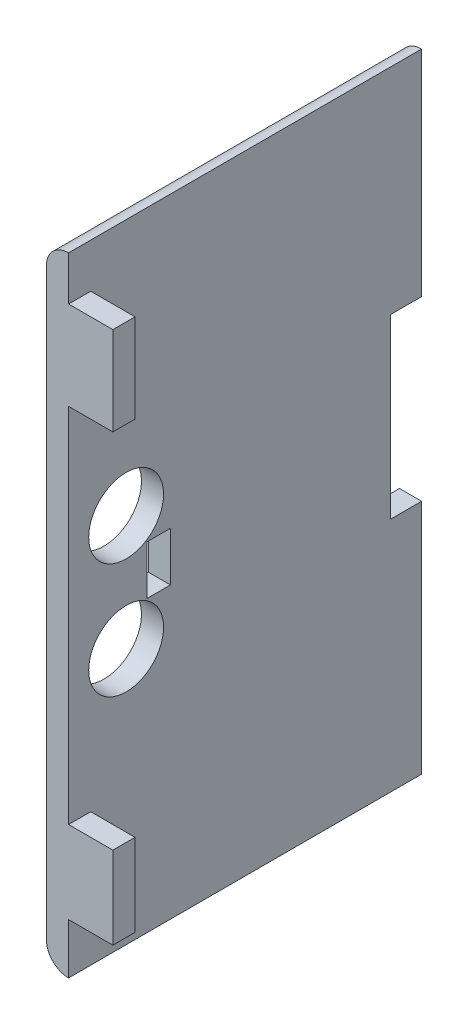
ISO-10303-21;
HEADER;
FILE_DESCRIPTION(('STEP AP214'),'2;1');
FILE_NAME('part.step','',(''),(''),'','','');
FILE_SCHEMA(('AUTOMOTIVE_DESIGN { 1 0 10303 214 1 1 1 1 }'));
ENDSEC;
DATA;
#1=APPLICATION_CONTEXT('core data for automotive mechanical design processes');
#2=APPLICATION_PROTOCOL_DEFINITION('international standard','automotive_design',2000,#1);
#3=PRODUCT_CONTEXT('',#1,'mechanical');
#4=PRODUCT('Part','Part','',(#3));
#5=PRODUCT_RELATED_PRODUCT_CATEGORY('part','',(#4));
#6=PRODUCT_DEFINITION_FORMATION('','',#4);
#7=PRODUCT_DEFINITION_CONTEXT('part definition',#1,'design');
#8=PRODUCT_DEFINITION('design','',#6,#7);
#9=PRODUCT_DEFINITION_SHAPE('','',#8);
#10=(LENGTH_UNIT() NAMED_UNIT(*) SI_UNIT(.MILLI.,.METRE.));
#11=(NAMED_UNIT(*) PLANE_ANGLE_UNIT() SI_UNIT($,.RADIAN.));
#12=(NAMED_UNIT(*) SI_UNIT($,.STERADIAN.) SOLID_ANGLE_UNIT());
#13=UNCERTAINTY_MEASURE_WITH_UNIT(LENGTH_MEASURE(1.E-05),#10,'distance_accuracy_value','');
#14=(GEOMETRIC_REPRESENTATION_CONTEXT(3) GLOBAL_UNCERTAINTY_ASSIGNED_CONTEXT((#13)) GLOBAL_UNIT_ASSIGNED_CONTEXT((#10,
#11,#12)) REPRESENTATION_CONTEXT('',''));
#15=CARTESIAN_POINT('',(0.,0.,0.));
#16=DIRECTION('',(0.,0.,1.));
#17=DIRECTION('',(1.,0.,0.));
#18=AXIS2_PLACEMENT_3D('',#15,#16,#17);
#19=CARTESIAN_POINT('',(-104.891736532619,68.3974089750559,-79.6889603598296));
#20=DIRECTION('',(0.,0.,1.));
#21=DIRECTION('',(1.,0.,0.));
#22=AXIS2_PLACEMENT_3D('',#19,#20,#21);
#23=PLANE('',#22);
#24=DIRECTION('',(0.,-1.,0.));
#25=VECTOR('',#24,1.);
#26=CARTESIAN_POINT('',(-104.891736532619,68.3974089750559,-79.6889603598296));
#27=LINE('',#26,#25);
#28=CARTESIAN_POINT('',(-104.891736532619,-20.,-79.6889603598296));
#29=VERTEX_POINT('',#28);
#30=CARTESIAN_POINT('',(-104.891736532619,-68.3438293693288,-79.6889603598296));
#31=VERTEX_POINT('',#30);
#32=EDGE_CURVE('E321',#29,#31,#27,.T.);
#33=ORIENTED_EDGE('',*,*,#32,.F.);
#34=DIRECTION('',(1.,0.,0.));
#35=VECTOR('',#34,1.);
#36=CARTESIAN_POINT('',(-109.891736532619,-20.,-79.6889603598296));
#37=LINE('',#36,#35);
#38=CARTESIAN_POINT('',(-99.8917365326188,-20.,-79.6889603598296));
#39=VERTEX_POINT('',#38);
#40=EDGE_CURVE('E254',#29,#39,#37,.T.);
#41=ORIENTED_EDGE('',*,*,#40,.T.);
#42=DIRECTION('',(0.,-1.,0.));
#43=VECTOR('',#42,1.);
#44=CARTESIAN_POINT('',(-99.8917365326188,68.3974089750559,-79.6889603598296));
#45=LINE('',#44,#43);
#46=CARTESIAN_POINT('',(-99.8917365326188,-73.3438293693289,-79.6889603598296));
#47=VERTEX_POINT('',#46);
#48=EDGE_CURVE('E333',#39,#47,#45,.T.);
#49=ORIENTED_EDGE('',*,*,#48,.T.);
#50=CARTESIAN_POINT('',(-99.8917365326188,-68.3438293693289,-79.6889603598296));
#51=DIRECTION('',(0.,0.,1.));
#52=DIRECTION('',(1.,0.,0.));
#53=AXIS2_PLACEMENT_3D('',#50,#51,#52);
#54=CIRCLE('',#53,5.);
#55=EDGE_CURVE('E358',#47,#31,#54,.F.);
#56=ORIENTED_EDGE('',*,*,#55,.T.);
#57=EDGE_LOOP('',(#33,#41,#49,#56));
#58=FACE_BOUND('',#57,.T.);
#59=ADVANCED_FACE('F73',(#58),#23,.F.);
#60=CARTESIAN_POINT('',(-104.891736532619,68.3974089750559,0.));
#61=DIRECTION('',(0.,0.,-1.));
#62=DIRECTION('',(-1.,0.,0.));
#63=AXIS2_PLACEMENT_3D('',#60,#61,#62);
#64=PLANE('',#63);
#65=DIRECTION('',(0.,1.,0.));
#66=VECTOR('',#65,1.);
#67=CARTESIAN_POINT('',(-99.8917365326188,68.3974089750559,0.));
#68=LINE('',#67,#66);
#69=CARTESIAN_POINT('',(-99.8917365326188,-73.3438293693288,0.));
#70=VERTEX_POINT('',#69);
#71=CARTESIAN_POINT('',(-99.8917365326188,-61.922986139183,0.));
#72=VERTEX_POINT('',#71);
#73=EDGE_CURVE('E327',#70,#72,#68,.T.);
#74=ORIENTED_EDGE('',*,*,#73,.T.);
#75=DIRECTION('',(1.,0.,0.));
#76=VECTOR('',#75,1.);
#77=CARTESIAN_POINT('',(-104.891736532619,-61.922986139183,0.));
#78=LINE('',#77,#76);
#79=CARTESIAN_POINT('',(-89.8917365326188,-61.922986139183,0.));
#80=VERTEX_POINT('',#79);
#81=EDGE_CURVE('E276',#72,#80,#78,.T.);
#82=ORIENTED_EDGE('',*,*,#81,.T.);
#83=DIRECTION('',(0.,1.,0.));
#84=VECTOR('',#83,1.);
#85=CARTESIAN_POINT('',(-89.8917365326188,-63.3438293693289,0.));
#86=LINE('',#85,#84);
#87=CARTESIAN_POINT('',(-89.8917365326188,-43.3438293693289,0.));
#88=VERTEX_POINT('',#87);
#89=EDGE_CURVE('E303',#80,#88,#86,.T.);
#90=ORIENTED_EDGE('',*,*,#89,.T.);
#91=DIRECTION('',(-1.,0.,0.));
#92=VECTOR('',#91,1.);
#93=CARTESIAN_POINT('',(-89.8917365326188,-43.3438293693289,0.));
#94=LINE('',#93,#92);
#95=CARTESIAN_POINT('',(-99.8917365326188,-43.3438293693289,0.));
#96=VERTEX_POINT('',#95);
#97=EDGE_CURVE('E311',#88,#96,#94,.T.);
#98=ORIENTED_EDGE('',*,*,#97,.T.);
#99=CARTESIAN_POINT('',(-99.8917365326188,38.397408975056,0.));
#100=VERTEX_POINT('',#99);
#101=EDGE_CURVE('E330',#96,#100,#68,.T.);
#102=ORIENTED_EDGE('',*,*,#101,.T.);
#103=DIRECTION('',(-1.,0.,0.));
#104=VECTOR('',#103,1.);
#105=CARTESIAN_POINT('',(-89.8917365326188,38.3974089750559,0.));
#106=LINE('',#105,#104);
#107=CARTESIAN_POINT('',(-89.8917365326188,38.3974089750559,0.));
#108=VERTEX_POINT('',#107);
#109=EDGE_CURVE('E279',#108,#100,#106,.T.);
#110=ORIENTED_EDGE('',*,*,#109,.F.);
#111=DIRECTION('',(0.,1.,0.));
#112=VECTOR('',#111,1.);
#113=CARTESIAN_POINT('',(-89.8917365326188,58.397408975056,0.));
#114=LINE('',#113,#112);
#115=CARTESIAN_POINT('',(-89.8917365326188,58.397408975056,0.));
#116=VERTEX_POINT('',#115);
#117=EDGE_CURVE('E300',#108,#116,#114,.T.);
#118=ORIENTED_EDGE('',*,*,#117,.T.);
#119=DIRECTION('',(-1.,0.,0.));
#120=VECTOR('',#119,1.);
#121=CARTESIAN_POINT('',(-89.8917365326188,58.397408975056,0.));
#122=LINE('',#121,#120);
#123=CARTESIAN_POINT('',(-99.8917365326188,58.397408975056,0.));
#124=VERTEX_POINT('',#123);
#125=EDGE_CURVE('E280',#116,#124,#122,.T.);
#126=ORIENTED_EDGE('',*,*,#125,.T.);
#127=CARTESIAN_POINT('',(-99.8917365326188,68.3974089750559,0.));
#128=VERTEX_POINT('',#127);
#129=EDGE_CURVE('E315',#124,#128,#68,.T.);
#130=ORIENTED_EDGE('',*,*,#129,.T.);
#131=CARTESIAN_POINT('',(-99.8917365326188,63.3974089750559,0.));
#132=DIRECTION('',(0.,0.,-1.));
#133=DIRECTION('',(-1.,0.,0.));
#134=AXIS2_PLACEMENT_3D('',#131,#132,#133);
#135=CIRCLE('',#134,5.);
#136=CARTESIAN_POINT('',(-104.891736532619,63.3974089750559,0.));
#137=VERTEX_POINT('',#136);
#138=EDGE_CURVE('E365',#128,#137,#135,.F.);
#139=ORIENTED_EDGE('',*,*,#138,.T.);
#140=DIRECTION('',(0.,1.,0.));
#141=VECTOR('',#140,1.);
#142=CARTESIAN_POINT('',(-104.891736532619,68.3974089750559,0.));
#143=LINE('',#142,#141);
#144=CARTESIAN_POINT('',(-104.891736532619,-68.3438293693288,0.));
#145=VERTEX_POINT('',#144);
#146=EDGE_CURVE('E318',#145,#137,#143,.T.);
#147=ORIENTED_EDGE('',*,*,#146,.F.);
#148=CARTESIAN_POINT('',(-99.8917365326188,-68.3438293693288,0.));
#149=DIRECTION('',(0.,0.,-1.));
#150=DIRECTION('',(-1.,0.,0.));
#151=AXIS2_PLACEMENT_3D('',#148,#149,#150);
#152=CIRCLE('',#151,5.);
#153=EDGE_CURVE('E363',#145,#70,#152,.F.);
#154=ORIENTED_EDGE('',*,*,#153,.T.);
#155=EDGE_LOOP('',(#74,#82,#90,#98,#102,#110,#118,#126,#130,#139,#147,#154));
#156=FACE_BOUND('',#155,.T.);
#157=ADVANCED_FACE('F398',(#156),#64,.F.);
#158=CARTESIAN_POINT('',(-99.8917365326188,68.3974089750559,-79.6889603598296));
#159=VERTEX_POINT('',#158);
#160=CARTESIAN_POINT('',(-99.8917365326188,20.,-79.6889603598296));
#161=VERTEX_POINT('',#160);
#162=EDGE_CURVE('E334',#159,#161,#45,.T.);
#163=ORIENTED_EDGE('',*,*,#162,.T.);
#164=DIRECTION('',(1.,0.,0.));
#165=VECTOR('',#164,1.);
#166=CARTESIAN_POINT('',(-109.891736532619,20.,-79.6889603598296));
#167=LINE('',#166,#165);
#168=CARTESIAN_POINT('',(-104.891736532619,20.,-79.6889603598296));
#169=VERTEX_POINT('',#168);
#170=EDGE_CURVE('E253',#169,#161,#167,.T.);
#171=ORIENTED_EDGE('',*,*,#170,.F.);
#172=CARTESIAN_POINT('',(-104.891736532619,63.3974089750559,-79.6889603598296));
#173=VERTEX_POINT('',#172);
#174=EDGE_CURVE('E323',#173,#169,#27,.T.);
#175=ORIENTED_EDGE('',*,*,#174,.F.);
#176=CARTESIAN_POINT('',(-99.8917365326188,63.3974089750559,-79.6889603598296));
#177=DIRECTION('',(0.,0.,1.));
#178=DIRECTION('',(1.,0.,0.));
#179=AXIS2_PLACEMENT_3D('',#176,#177,#178);
#180=CIRCLE('',#179,5.);
#181=EDGE_CURVE('E361',#173,#159,#180,.F.);
#182=ORIENTED_EDGE('',*,*,#181,.T.);
#183=EDGE_LOOP('',(#163,#171,#175,#182));
#184=FACE_BOUND('',#183,.T.);
#185=ADVANCED_FACE('F401',(#184),#23,.F.);
#186=CARTESIAN_POINT('',(-104.891736532619,0.,0.));
#187=DIRECTION('',(1.,0.,0.));
#188=DIRECTION('',(0.,0.,-1.));
#189=AXIS2_PLACEMENT_3D('',#186,#187,#188);
#190=PLANE('',#189);
#191=CARTESIAN_POINT('',(-104.891736532619,-15.4732101971364,-13.));
#192=DIRECTION('',(-1.,0.,0.));
#193=DIRECTION('',(0.,0.,1.));
#194=AXIS2_PLACEMENT_3D('',#191,#192,#193);
#195=CIRCLE('',#194,8.45);
#196=CARTESIAN_POINT('',(-104.891736532619,-15.4732101971364,-4.55));
#197=VERTEX_POINT('',#196);
#198=EDGE_CURVE('E236',#197,#197,#195,.T.);
#199=ORIENTED_EDGE('',*,*,#198,.F.);
#200=EDGE_LOOP('',(#199));
#201=FACE_BOUND('',#200,.T.);
#202=DIRECTION('',(0.,0.,-1.));
#203=VECTOR('',#202,1.);
#204=CARTESIAN_POINT('',(-104.891736532619,3.06678980286357,0.));
#205=LINE('',#204,#203);
#206=CARTESIAN_POINT('',(-104.891736532619,3.06678980286356,-17.68));
#207=VERTEX_POINT('',#206);
#208=CARTESIAN_POINT('',(-104.891736532619,3.06678980286356,-23.));
#209=VERTEX_POINT('',#208);
#210=EDGE_CURVE('E222',#207,#209,#205,.T.);
#211=ORIENTED_EDGE('',*,*,#210,.F.);
#212=DIRECTION('',(0.,1.,0.));
#213=VECTOR('',#212,1.);
#214=CARTESIAN_POINT('',(-104.891736532619,0.,-17.68));
#215=LINE('',#214,#213);
#216=CARTESIAN_POINT('',(-104.891736532619,-8.01321019713644,-17.68));
#217=VERTEX_POINT('',#216);
#218=EDGE_CURVE('E89',#217,#207,#215,.T.);
#219=ORIENTED_EDGE('',*,*,#218,.F.);
#220=DIRECTION('',(0.,0.,1.));
#221=VECTOR('',#220,1.);
#222=CARTESIAN_POINT('',(-104.891736532619,-8.01321019713643,0.));
#223=LINE('',#222,#221);
#224=CARTESIAN_POINT('',(-104.891736532619,-8.01321019713644,-23.));
#225=VERTEX_POINT('',#224);
#226=EDGE_CURVE('E229',#225,#217,#223,.T.);
#227=ORIENTED_EDGE('',*,*,#226,.F.);
#228=DIRECTION('',(0.,1.,0.));
#229=VECTOR('',#228,1.);
#230=CARTESIAN_POINT('',(-104.891736532619,0.,-23.));
#231=LINE('',#230,#229);
#232=EDGE_CURVE('E213',#225,#209,#231,.T.);
#233=ORIENTED_EDGE('',*,*,#232,.T.);
#234=EDGE_LOOP('',(#211,#219,#227,#233));
#235=FACE_BOUND('',#234,.T.);
#236=CARTESIAN_POINT('',(-104.891736532619,10.5267898028636,-13.));
#237=DIRECTION('',(-1.,0.,0.));
#238=DIRECTION('',(0.,0.,1.));
#239=AXIS2_PLACEMENT_3D('',#236,#237,#238);
#240=CIRCLE('',#239,8.45);
#241=CARTESIAN_POINT('',(-104.891736532619,10.5267898028636,-4.55));
#242=VERTEX_POINT('',#241);
#243=EDGE_CURVE('E241',#242,#242,#240,.T.);
#244=ORIENTED_EDGE('',*,*,#243,.F.);
#245=EDGE_LOOP('',(#244));
#246=FACE_BOUND('',#245,.T.);
#247=DIRECTION('',(0.,-1.,0.));
#248=VECTOR('',#247,1.);
#249=CARTESIAN_POINT('',(-104.891736532619,0.,-72.6889603598296));
#250=LINE('',#249,#248);
#251=CARTESIAN_POINT('',(-104.891736532619,20.,-72.6889603598296));
#252=VERTEX_POINT('',#251);
#253=CARTESIAN_POINT('',(-104.891736532619,-20.,-72.6889603598296));
#254=VERTEX_POINT('',#253);
#255=EDGE_CURVE('E265',#252,#254,#250,.T.);
#256=ORIENTED_EDGE('',*,*,#255,.T.);
#257=DIRECTION('',(0.,0.,-1.));
#258=VECTOR('',#257,1.);
#259=CARTESIAN_POINT('',(-104.891736532619,-19.9999999999999,0.));
#260=LINE('',#259,#258);
#261=EDGE_CURVE('E268',#254,#29,#260,.T.);
#262=ORIENTED_EDGE('',*,*,#261,.T.);
#263=ORIENTED_EDGE('',*,*,#32,.T.);
#264=DIRECTION('',(0.,0.,1.));
#265=VECTOR('',#264,1.);
#266=CARTESIAN_POINT('',(-104.891736532619,-68.3438293693288,0.));
#267=LINE('',#266,#265);
#268=EDGE_CURVE('E352',#31,#145,#267,.T.);
#269=ORIENTED_EDGE('',*,*,#268,.T.);
#270=ORIENTED_EDGE('',*,*,#146,.T.);
#271=DIRECTION('',(0.,0.,-1.));
#272=VECTOR('',#271,1.);
#273=CARTESIAN_POINT('',(-104.891736532619,63.3974089750559,0.));
#274=LINE('',#273,#272);
#275=EDGE_CURVE('E355',#137,#173,#274,.T.);
#276=ORIENTED_EDGE('',*,*,#275,.T.);
#277=ORIENTED_EDGE('',*,*,#174,.T.);
#278=DIRECTION('',(0.,0.,1.));
#279=VECTOR('',#278,1.);
#280=CARTESIAN_POINT('',(-104.891736532619,20.,0.));
#281=LINE('',#280,#279);
#282=EDGE_CURVE('E257',#169,#252,#281,.T.);
#283=ORIENTED_EDGE('',*,*,#282,.T.);
#284=EDGE_LOOP('',(#256,#262,#263,#269,#270,#276,#277,#283));
#285=FACE_BOUND('',#284,.T.);
#286=ADVANCED_FACE('F226',(#201,#235,#246,#285),#190,.F.);
#287=CARTESIAN_POINT('',(-99.8917365326188,0.,0.));
#288=DIRECTION('',(1.,0.,0.));
#289=DIRECTION('',(0.,0.,-1.));
#290=AXIS2_PLACEMENT_3D('',#287,#288,#289);
#291=PLANE('',#290);
#292=CARTESIAN_POINT('',(-99.8917365326188,-15.4732101971364,-13.));
#293=DIRECTION('',(1.,0.,0.));
#294=DIRECTION('',(0.,0.,-1.));
#295=AXIS2_PLACEMENT_3D('',#292,#293,#294);
#296=CIRCLE('',#295,8.45);
#297=CARTESIAN_POINT('',(-99.8917365326188,-15.4732101971364,-21.45));
#298=VERTEX_POINT('',#297);
#299=EDGE_CURVE('E77',#298,#298,#296,.T.);
#300=ORIENTED_EDGE('',*,*,#299,.F.);
#301=EDGE_LOOP('',(#300));
#302=FACE_BOUND('',#301,.T.);
#303=DIRECTION('',(0.,-1.,0.));
#304=VECTOR('',#303,1.);
#305=CARTESIAN_POINT('',(-99.8917365326188,0.,-17.68));
#306=LINE('',#305,#304);
#307=CARTESIAN_POINT('',(-99.8917365326188,3.06678980286356,-17.68));
#308=VERTEX_POINT('',#307);
#309=CARTESIAN_POINT('',(-99.8917365326188,-8.01321019713644,-17.68));
#310=VERTEX_POINT('',#309);
#311=EDGE_CURVE('E12',#308,#310,#306,.T.);
#312=ORIENTED_EDGE('',*,*,#311,.F.);
#313=DIRECTION('',(0.,0.,1.));
#314=VECTOR('',#313,1.);
#315=CARTESIAN_POINT('',(-99.8917365326188,3.06678980286357,0.));
#316=LINE('',#315,#314);
#317=CARTESIAN_POINT('',(-99.8917365326188,3.06678980286355,-23.));
#318=VERTEX_POINT('',#317);
#319=EDGE_CURVE('E370',#318,#308,#316,.T.);
#320=ORIENTED_EDGE('',*,*,#319,.F.);
#321=DIRECTION('',(0.,-1.,0.));
#322=VECTOR('',#321,1.);
#323=CARTESIAN_POINT('',(-99.8917365326188,0.,-23.));
#324=LINE('',#323,#322);
#325=CARTESIAN_POINT('',(-99.8917365326188,-8.01321019713644,-23.));
#326=VERTEX_POINT('',#325);
#327=EDGE_CURVE('E216',#318,#326,#324,.T.);
#328=ORIENTED_EDGE('',*,*,#327,.T.);
#329=DIRECTION('',(0.,0.,-1.));
#330=VECTOR('',#329,1.);
#331=CARTESIAN_POINT('',(-99.8917365326188,-8.01321019713643,0.));
#332=LINE('',#331,#330);
#333=EDGE_CURVE('E82',#310,#326,#332,.T.);
#334=ORIENTED_EDGE('',*,*,#333,.F.);
#335=EDGE_LOOP('',(#312,#320,#328,#334));
#336=FACE_BOUND('',#335,.T.);
#337=CARTESIAN_POINT('',(-99.8917365326188,10.5267898028636,-13.));
#338=DIRECTION('',(1.,0.,0.));
#339=DIRECTION('',(0.,0.,-1.));
#340=AXIS2_PLACEMENT_3D('',#337,#338,#339);
#341=CIRCLE('',#340,8.45);
#342=CARTESIAN_POINT('',(-99.8917365326188,10.5267898028636,-21.45));
#343=VERTEX_POINT('',#342);
#344=EDGE_CURVE('E244',#343,#343,#341,.T.);
#345=ORIENTED_EDGE('',*,*,#344,.F.);
#346=EDGE_LOOP('',(#345));
#347=FACE_BOUND('',#346,.T.);
#348=DIRECTION('',(0.,0.,-1.));
#349=VECTOR('',#348,1.);
#350=CARTESIAN_POINT('',(-99.8917365326188,-20.,-79.6889603598296));
#351=LINE('',#350,#349);
#352=CARTESIAN_POINT('',(-99.8917365326188,-20.,-72.6889603598296));
#353=VERTEX_POINT('',#352);
#354=EDGE_CURVE('E251',#353,#39,#351,.T.);
#355=ORIENTED_EDGE('',*,*,#354,.F.);
#356=DIRECTION('',(0.,-1.,0.));
#357=VECTOR('',#356,1.);
#358=CARTESIAN_POINT('',(-99.8917365326188,20.,-72.6889603598296));
#359=LINE('',#358,#357);
#360=CARTESIAN_POINT('',(-99.8917365326188,20.,-72.6889603598296));
#361=VERTEX_POINT('',#360);
#362=EDGE_CURVE('E248',#361,#353,#359,.T.);
#363=ORIENTED_EDGE('',*,*,#362,.F.);
#364=DIRECTION('',(0.,0.,1.));
#365=VECTOR('',#364,1.);
#366=CARTESIAN_POINT('',(-99.8917365326188,20.,-79.6889603598296));
#367=LINE('',#366,#365);
#368=EDGE_CURVE('E245',#161,#361,#367,.T.);
#369=ORIENTED_EDGE('',*,*,#368,.F.);
#370=ORIENTED_EDGE('',*,*,#162,.F.);
#371=DIRECTION('',(0.,0.,-1.));
#372=VECTOR('',#371,1.);
#373=CARTESIAN_POINT('',(-99.8917365326188,68.3974089750559,0.));
#374=LINE('',#373,#372);
#375=EDGE_CURVE('E329',#128,#159,#374,.T.);
#376=ORIENTED_EDGE('',*,*,#375,.F.);
#377=ORIENTED_EDGE('',*,*,#129,.F.);
#378=DIRECTION('',(0.,0.,1.));
#379=VECTOR('',#378,1.);
#380=CARTESIAN_POINT('',(-99.8917365326188,58.397408975056,0.));
#381=LINE('',#380,#379);
#382=CARTESIAN_POINT('',(-99.8917365326188,58.397408975056,-5.00000000000002));
#383=VERTEX_POINT('',#382);
#384=EDGE_CURVE('E343',#383,#124,#381,.T.);
#385=ORIENTED_EDGE('',*,*,#384,.F.);
#386=DIRECTION('',(0.,1.,0.));
#387=VECTOR('',#386,1.);
#388=CARTESIAN_POINT('',(-99.8917365326188,0.,-5.));
#389=LINE('',#388,#387);
#390=CARTESIAN_POINT('',(-99.8917365326188,38.3974089750559,-5.00000000000001));
#391=VERTEX_POINT('',#390);
#392=EDGE_CURVE('E346',#391,#383,#389,.T.);
#393=ORIENTED_EDGE('',*,*,#392,.F.);
#394=DIRECTION('',(0.,0.,-1.));
#395=VECTOR('',#394,1.);
#396=CARTESIAN_POINT('',(-99.8917365326188,38.3974089750559,0.));
#397=LINE('',#396,#395);
#398=EDGE_CURVE('E349',#100,#391,#397,.T.);
#399=ORIENTED_EDGE('',*,*,#398,.F.);
#400=ORIENTED_EDGE('',*,*,#101,.F.);
#401=DIRECTION('',(0.,0.,1.));
#402=VECTOR('',#401,1.);
#403=CARTESIAN_POINT('',(-99.8917365326188,-43.3438293693289,0.));
#404=LINE('',#403,#402);
#405=CARTESIAN_POINT('',(-99.8917365326188,-43.3438293693289,-5.));
#406=VERTEX_POINT('',#405);
#407=EDGE_CURVE('E326',#406,#96,#404,.T.);
#408=ORIENTED_EDGE('',*,*,#407,.F.);
#409=DIRECTION('',(0.,1.,0.));
#410=VECTOR('',#409,1.);
#411=CARTESIAN_POINT('',(-99.8917365326188,0.,-5.));
#412=LINE('',#411,#410);
#413=CARTESIAN_POINT('',(-99.8917365326188,-61.922986139183,-5.));
#414=VERTEX_POINT('',#413);
#415=EDGE_CURVE('E341',#414,#406,#412,.T.);
#416=ORIENTED_EDGE('',*,*,#415,.F.);
#417=DIRECTION('',(0.,0.,1.));
#418=VECTOR('',#417,1.);
#419=CARTESIAN_POINT('',(-99.8917365326188,-61.922986139183,-79.6889603598296));
#420=LINE('',#419,#418);
#421=EDGE_CURVE('E271',#414,#72,#420,.T.);
#422=ORIENTED_EDGE('',*,*,#421,.T.);
#423=ORIENTED_EDGE('',*,*,#73,.F.);
#424=DIRECTION('',(0.,0.,1.));
#425=VECTOR('',#424,1.);
#426=CARTESIAN_POINT('',(-99.8917365326188,-73.3438293693288,0.));
#427=LINE('',#426,#425);
#428=EDGE_CURVE('E322',#47,#70,#427,.T.);
#429=ORIENTED_EDGE('',*,*,#428,.F.);
#430=ORIENTED_EDGE('',*,*,#48,.F.);
#431=EDGE_LOOP('',(#355,#363,#369,#370,#376,#377,#385,#393,#399,#400,#408,#416,#422,#423,#429,#430));
#432=FACE_BOUND('',#431,.T.);
#433=ADVANCED_FACE('F381',(#302,#336,#347,#432),#291,.T.);
#434=CARTESIAN_POINT('',(-89.8917365326188,-63.3438293693289,-5.));
#435=DIRECTION('',(0.,0.,-1.));
#436=DIRECTION('',(-1.,0.,0.));
#437=AXIS2_PLACEMENT_3D('',#434,#435,#436);
#438=PLANE('',#437);
#439=DIRECTION('',(1.,0.,0.));
#440=VECTOR('',#439,1.);
#441=CARTESIAN_POINT('',(-89.8917365326188,-61.922986139183,-5.));
#442=LINE('',#441,#440);
#443=CARTESIAN_POINT('',(-89.8917365326188,-61.922986139183,-5.));
#444=VERTEX_POINT('',#443);
#445=EDGE_CURVE('E274',#414,#444,#442,.T.);
#446=ORIENTED_EDGE('',*,*,#445,.F.);
#447=ORIENTED_EDGE('',*,*,#415,.T.);
#448=DIRECTION('',(-1.,0.,0.));
#449=VECTOR('',#448,1.);
#450=CARTESIAN_POINT('',(-89.8917365326188,-43.3438293693289,-5.));
#451=LINE('',#450,#449);
#452=CARTESIAN_POINT('',(-89.8917365326188,-43.3438293693289,-5.));
#453=VERTEX_POINT('',#452);
#454=EDGE_CURVE('E312',#453,#406,#451,.T.);
#455=ORIENTED_EDGE('',*,*,#454,.F.);
#456=DIRECTION('',(0.,-1.,0.));
#457=VECTOR('',#456,1.);
#458=CARTESIAN_POINT('',(-89.8917365326188,-63.3438293693289,-5.));
#459=LINE('',#458,#457);
#460=EDGE_CURVE('E308',#453,#444,#459,.T.);
#461=ORIENTED_EDGE('',*,*,#460,.T.);
#462=EDGE_LOOP('',(#446,#447,#455,#461));
#463=FACE_BOUND('',#462,.T.);
#464=ADVANCED_FACE('F445',(#463),#438,.T.);
#465=CARTESIAN_POINT('',(-89.8917365326188,-43.3438293693289,0.));
#466=DIRECTION('',(0.,1.,0.));
#467=DIRECTION('',(0.,0.,1.));
#468=AXIS2_PLACEMENT_3D('',#465,#466,#467);
#469=PLANE('',#468);
#470=ORIENTED_EDGE('',*,*,#454,.T.);
#471=ORIENTED_EDGE('',*,*,#407,.T.);
#472=ORIENTED_EDGE('',*,*,#97,.F.);
#473=DIRECTION('',(0.,0.,-1.));
#474=VECTOR('',#473,1.);
#475=CARTESIAN_POINT('',(-89.8917365326188,-43.3438293693289,0.));
#476=LINE('',#475,#474);
#477=EDGE_CURVE('E305',#88,#453,#476,.T.);
#478=ORIENTED_EDGE('',*,*,#477,.T.);
#479=EDGE_LOOP('',(#470,#471,#472,#478));
#480=FACE_BOUND('',#479,.T.);
#481=ADVANCED_FACE('F453',(#480),#469,.T.);
#482=CARTESIAN_POINT('',(-89.8917365326188,0.,0.));
#483=DIRECTION('',(-1.,0.,0.));
#484=DIRECTION('',(0.,0.,1.));
#485=AXIS2_PLACEMENT_3D('',#482,#483,#484);
#486=PLANE('',#485);
#487=ORIENTED_EDGE('',*,*,#89,.F.);
#488=DIRECTION('',(0.,0.,-1.));
#489=VECTOR('',#488,1.);
#490=CARTESIAN_POINT('',(-89.8917365326188,-61.922986139183,0.));
#491=LINE('',#490,#489);
#492=EDGE_CURVE('E367',#80,#444,#491,.T.);
#493=ORIENTED_EDGE('',*,*,#492,.T.);
#494=ORIENTED_EDGE('',*,*,#460,.F.);
#495=ORIENTED_EDGE('',*,*,#477,.F.);
#496=EDGE_LOOP('',(#487,#493,#494,#495));
#497=FACE_BOUND('',#496,.T.);
#498=ADVANCED_FACE('F450',(#497),#486,.F.);
#499=CARTESIAN_POINT('',(-89.8917365326188,38.3974089750559,0.));
#500=DIRECTION('',(0.,-1.,0.));
#501=DIRECTION('',(0.,0.,-1.));
#502=AXIS2_PLACEMENT_3D('',#499,#500,#501);
#503=PLANE('',#502);
#504=ORIENTED_EDGE('',*,*,#109,.T.);
#505=ORIENTED_EDGE('',*,*,#398,.T.);
#506=DIRECTION('',(-1.,0.,0.));
#507=VECTOR('',#506,1.);
#508=CARTESIAN_POINT('',(-89.8917365326188,38.3974089750559,-5.00000000000001));
#509=LINE('',#508,#507);
#510=CARTESIAN_POINT('',(-89.8917365326188,38.3974089750559,-5.00000000000001));
#511=VERTEX_POINT('',#510);
#512=EDGE_CURVE('E287',#511,#391,#509,.T.);
#513=ORIENTED_EDGE('',*,*,#512,.F.);
#514=DIRECTION('',(0.,0.,1.));
#515=VECTOR('',#514,1.);
#516=CARTESIAN_POINT('',(-89.8917365326188,38.3974089750559,0.));
#517=LINE('',#516,#515);
#518=EDGE_CURVE('E283',#511,#108,#517,.T.);
#519=ORIENTED_EDGE('',*,*,#518,.T.);
#520=EDGE_LOOP('',(#504,#505,#513,#519));
#521=FACE_BOUND('',#520,.T.);
#522=ADVANCED_FACE('F457',(#521),#503,.T.);
#523=CARTESIAN_POINT('',(-89.8917365326188,58.397408975056,-5.00000000000002));
#524=DIRECTION('',(0.,0.,-1.));
#525=DIRECTION('',(0.,1.,0.));
#526=AXIS2_PLACEMENT_3D('',#523,#524,#525);
#527=PLANE('',#526);
#528=ORIENTED_EDGE('',*,*,#512,.T.);
#529=ORIENTED_EDGE('',*,*,#392,.T.);
#530=DIRECTION('',(-1.,0.,0.));
#531=VECTOR('',#530,1.);
#532=CARTESIAN_POINT('',(-89.8917365326188,58.397408975056,-5.00000000000002));
#533=LINE('',#532,#531);
#534=CARTESIAN_POINT('',(-89.8917365326188,58.397408975056,-5.00000000000002));
#535=VERTEX_POINT('',#534);
#536=EDGE_CURVE('E284',#535,#383,#533,.T.);
#537=ORIENTED_EDGE('',*,*,#536,.F.);
#538=DIRECTION('',(0.,-1.,0.));
#539=VECTOR('',#538,1.);
#540=CARTESIAN_POINT('',(-89.8917365326188,58.397408975056,-5.00000000000002));
#541=LINE('',#540,#539);
#542=EDGE_CURVE('E294',#535,#511,#541,.T.);
#543=ORIENTED_EDGE('',*,*,#542,.T.);
#544=EDGE_LOOP('',(#528,#529,#537,#543));
#545=FACE_BOUND('',#544,.T.);
#546=ADVANCED_FACE('F466',(#545),#527,.T.);
#547=CARTESIAN_POINT('',(-89.8917365326188,58.397408975056,0.));
#548=DIRECTION('',(0.,1.,0.));
#549=DIRECTION('',(0.,0.,1.));
#550=AXIS2_PLACEMENT_3D('',#547,#548,#549);
#551=PLANE('',#550);
#552=ORIENTED_EDGE('',*,*,#536,.T.);
#553=ORIENTED_EDGE('',*,*,#384,.T.);
#554=ORIENTED_EDGE('',*,*,#125,.F.);
#555=DIRECTION('',(0.,0.,-1.));
#556=VECTOR('',#555,1.);
#557=CARTESIAN_POINT('',(-89.8917365326188,58.397408975056,0.));
#558=LINE('',#557,#556);
#559=EDGE_CURVE('E297',#116,#535,#558,.T.);
#560=ORIENTED_EDGE('',*,*,#559,.T.);
#561=EDGE_LOOP('',(#552,#553,#554,#560));
#562=FACE_BOUND('',#561,.T.);
#563=ADVANCED_FACE('F464',(#562),#551,.T.);
#564=CARTESIAN_POINT('',(-89.8917365326188,0.,0.));
#565=DIRECTION('',(1.,0.,0.));
#566=DIRECTION('',(0.,0.,-1.));
#567=AXIS2_PLACEMENT_3D('',#564,#565,#566);
#568=PLANE('',#567);
#569=ORIENTED_EDGE('',*,*,#117,.F.);
#570=ORIENTED_EDGE('',*,*,#518,.F.);
#571=ORIENTED_EDGE('',*,*,#542,.F.);
#572=ORIENTED_EDGE('',*,*,#559,.F.);
#573=EDGE_LOOP('',(#569,#570,#571,#572));
#574=FACE_BOUND('',#573,.T.);
#575=ADVANCED_FACE('F461',(#574),#568,.T.);
#576=CARTESIAN_POINT('',(-99.8917365326188,63.3974089750559,0.));
#577=DIRECTION('',(0.,0.,-1.));
#578=DIRECTION('',(0.,1.,0.));
#579=AXIS2_PLACEMENT_3D('',#576,#577,#578);
#580=CYLINDRICAL_SURFACE('',#579,5.);
#581=ORIENTED_EDGE('',*,*,#138,.F.);
#582=ORIENTED_EDGE('',*,*,#375,.T.);
#583=ORIENTED_EDGE('',*,*,#181,.F.);
#584=ORIENTED_EDGE('',*,*,#275,.F.);
#585=EDGE_LOOP('',(#581,#582,#583,#584));
#586=FACE_BOUND('',#585,.T.);
#587=ADVANCED_FACE('F428',(#586),#580,.T.);
#588=CARTESIAN_POINT('',(-99.8917365326188,-68.3438293693288,0.));
#589=DIRECTION('',(0.,0.,1.));
#590=DIRECTION('',(0.,-1.,0.));
#591=AXIS2_PLACEMENT_3D('',#588,#589,#590);
#592=CYLINDRICAL_SURFACE('',#591,5.);
#593=ORIENTED_EDGE('',*,*,#55,.F.);
#594=ORIENTED_EDGE('',*,*,#428,.T.);
#595=ORIENTED_EDGE('',*,*,#153,.F.);
#596=ORIENTED_EDGE('',*,*,#268,.F.);
#597=EDGE_LOOP('',(#593,#594,#595,#596));
#598=FACE_BOUND('',#597,.T.);
#599=ADVANCED_FACE('F75',(#598),#592,.T.);
#600=CARTESIAN_POINT('',(-88.4783099685743,-61.922986139183,-79.6889603598296));
#601=DIRECTION('',(0.,1.,0.));
#602=DIRECTION('',(-1.,0.,0.));
#603=AXIS2_PLACEMENT_3D('',#600,#601,#602);
#604=PLANE('',#603);
#605=ORIENTED_EDGE('',*,*,#421,.F.);
#606=ORIENTED_EDGE('',*,*,#445,.T.);
#607=ORIENTED_EDGE('',*,*,#492,.F.);
#608=ORIENTED_EDGE('',*,*,#81,.F.);
#609=EDGE_LOOP('',(#605,#606,#607,#608));
#610=FACE_BOUND('',#609,.T.);
#611=ADVANCED_FACE('F443',(#610),#604,.F.);
#612=CARTESIAN_POINT('',(-109.891736532619,-20.,-79.6889603598296));
#613=DIRECTION('',(0.,-1.,0.));
#614=DIRECTION('',(0.,0.,-1.));
#615=AXIS2_PLACEMENT_3D('',#612,#613,#614);
#616=PLANE('',#615);
#617=DIRECTION('',(1.,0.,0.));
#618=VECTOR('',#617,1.);
#619=CARTESIAN_POINT('',(-109.891736532619,-20.,-72.6889603598296));
#620=LINE('',#619,#618);
#621=EDGE_CURVE('E258',#254,#353,#620,.T.);
#622=ORIENTED_EDGE('',*,*,#621,.T.);
#623=ORIENTED_EDGE('',*,*,#354,.T.);
#624=ORIENTED_EDGE('',*,*,#40,.F.);
#625=ORIENTED_EDGE('',*,*,#261,.F.);
#626=EDGE_LOOP('',(#622,#623,#624,#625));
#627=FACE_BOUND('',#626,.T.);
#628=ADVANCED_FACE('F499',(#627),#616,.F.);
#629=CARTESIAN_POINT('',(-109.891736532619,20.,-72.6889603598296));
#630=DIRECTION('',(0.,0.,1.));
#631=DIRECTION('',(1.,0.,0.));
#632=AXIS2_PLACEMENT_3D('',#629,#630,#631);
#633=PLANE('',#632);
#634=DIRECTION('',(1.,0.,0.));
#635=VECTOR('',#634,1.);
#636=CARTESIAN_POINT('',(-109.891736532619,20.,-72.6889603598296));
#637=LINE('',#636,#635);
#638=EDGE_CURVE('E260',#252,#361,#637,.T.);
#639=ORIENTED_EDGE('',*,*,#638,.T.);
#640=ORIENTED_EDGE('',*,*,#362,.T.);
#641=ORIENTED_EDGE('',*,*,#621,.F.);
#642=ORIENTED_EDGE('',*,*,#255,.F.);
#643=EDGE_LOOP('',(#639,#640,#641,#642));
#644=FACE_BOUND('',#643,.T.);
#645=ADVANCED_FACE('F501',(#644),#633,.F.);
#646=CARTESIAN_POINT('',(-109.891736532619,20.,-79.6889603598296));
#647=DIRECTION('',(0.,1.,0.));
#648=DIRECTION('',(0.,0.,1.));
#649=AXIS2_PLACEMENT_3D('',#646,#647,#648);
#650=PLANE('',#649);
#651=ORIENTED_EDGE('',*,*,#170,.T.);
#652=ORIENTED_EDGE('',*,*,#368,.T.);
#653=ORIENTED_EDGE('',*,*,#638,.F.);
#654=ORIENTED_EDGE('',*,*,#282,.F.);
#655=EDGE_LOOP('',(#651,#652,#653,#654));
#656=FACE_BOUND('',#655,.T.);
#657=ADVANCED_FACE('F392',(#656),#650,.F.);
#658=CARTESIAN_POINT('',(-9.89173653261877,10.5267898028636,-13.));
#659=DIRECTION('',(-1.,0.,0.));
#660=DIRECTION('',(0.,0.,1.));
#661=AXIS2_PLACEMENT_3D('',#658,#659,#660);
#662=CYLINDRICAL_SURFACE('',#661,8.45);
#663=ORIENTED_EDGE('',*,*,#344,.T.);
#664=EDGE_LOOP('',(#663));
#665=FACE_BOUND('',#664,.T.);
#666=ORIENTED_EDGE('',*,*,#243,.T.);
#667=EDGE_LOOP('',(#666));
#668=FACE_BOUND('',#667,.T.);
#669=ADVANCED_FACE('F385',(#665,#668),#662,.F.);
#670=CARTESIAN_POINT('',(-9.89173653261877,0.,-17.68));
#671=DIRECTION('',(0.,0.,1.));
#672=DIRECTION('',(1.,0.,0.));
#673=AXIS2_PLACEMENT_3D('',#670,#671,#672);
#674=PLANE('',#673);
#675=ORIENTED_EDGE('',*,*,#311,.T.);
#676=DIRECTION('',(-1.,0.,0.));
#677=VECTOR('',#676,1.);
#678=CARTESIAN_POINT('',(-9.89173653261877,-8.01321019713644,-17.68));
#679=LINE('',#678,#677);
#680=EDGE_CURVE('E234',#310,#217,#679,.T.);
#681=ORIENTED_EDGE('',*,*,#680,.T.);
#682=ORIENTED_EDGE('',*,*,#218,.T.);
#683=DIRECTION('',(-1.,0.,0.));
#684=VECTOR('',#683,1.);
#685=CARTESIAN_POINT('',(-9.89173653261877,3.06678980286356,-17.68));
#686=LINE('',#685,#684);
#687=EDGE_CURVE('E219',#308,#207,#686,.T.);
#688=ORIENTED_EDGE('',*,*,#687,.F.);
#689=EDGE_LOOP('',(#675,#681,#682,#688));
#690=FACE_BOUND('',#689,.T.);
#691=ADVANCED_FACE('F383',(#690),#674,.F.);
#692=CARTESIAN_POINT('',(-9.89173653261877,-8.01321019713643,0.));
#693=DIRECTION('',(0.,-1.,0.));
#694=DIRECTION('',(0.,0.,-1.));
#695=AXIS2_PLACEMENT_3D('',#692,#693,#694);
#696=PLANE('',#695);
#697=ORIENTED_EDGE('',*,*,#333,.T.);
#698=DIRECTION('',(-1.,0.,0.));
#699=VECTOR('',#698,1.);
#700=CARTESIAN_POINT('',(-9.89173653261877,-8.01321019713644,-23.));
#701=LINE('',#700,#699);
#702=EDGE_CURVE('E218',#326,#225,#701,.T.);
#703=ORIENTED_EDGE('',*,*,#702,.T.);
#704=ORIENTED_EDGE('',*,*,#226,.T.);
#705=ORIENTED_EDGE('',*,*,#680,.F.);
#706=EDGE_LOOP('',(#697,#703,#704,#705));
#707=FACE_BOUND('',#706,.T.);
#708=ADVANCED_FACE('F378',(#707),#696,.F.);
#709=CARTESIAN_POINT('',(-9.89173653261877,0.,-23.));
#710=DIRECTION('',(0.,0.,1.));
#711=DIRECTION('',(0.,-1.,0.));
#712=AXIS2_PLACEMENT_3D('',#709,#710,#711);
#713=PLANE('',#712);
#714=DIRECTION('',(-1.,0.,0.));
#715=VECTOR('',#714,1.);
#716=CARTESIAN_POINT('',(-9.89173653261877,3.06678980286356,-23.));
#717=LINE('',#716,#715);
#718=EDGE_CURVE('E97',#318,#209,#717,.T.);
#719=ORIENTED_EDGE('',*,*,#718,.T.);
#720=ORIENTED_EDGE('',*,*,#232,.F.);
#721=ORIENTED_EDGE('',*,*,#702,.F.);
#722=ORIENTED_EDGE('',*,*,#327,.F.);
#723=EDGE_LOOP('',(#719,#720,#721,#722));
#724=FACE_BOUND('',#723,.T.);
#725=ADVANCED_FACE('F210',(#724),#713,.T.);
#726=CARTESIAN_POINT('',(-9.89173653261877,3.06678980286357,0.));
#727=DIRECTION('',(0.,1.,0.));
#728=DIRECTION('',(0.,0.,1.));
#729=AXIS2_PLACEMENT_3D('',#726,#727,#728);
#730=PLANE('',#729);
#731=ORIENTED_EDGE('',*,*,#319,.T.);
#732=ORIENTED_EDGE('',*,*,#687,.T.);
#733=ORIENTED_EDGE('',*,*,#210,.T.);
#734=ORIENTED_EDGE('',*,*,#718,.F.);
#735=EDGE_LOOP('',(#731,#732,#733,#734));
#736=FACE_BOUND('',#735,.T.);
#737=ADVANCED_FACE('F223',(#736),#730,.F.);
#738=CARTESIAN_POINT('',(-9.89173653261877,-15.4732101971364,-13.));
#739=DIRECTION('',(-1.,0.,0.));
#740=DIRECTION('',(0.,0.,1.));
#741=AXIS2_PLACEMENT_3D('',#738,#739,#740);
#742=CYLINDRICAL_SURFACE('',#741,8.45);
#743=ORIENTED_EDGE('',*,*,#299,.T.);
#744=EDGE_LOOP('',(#743));
#745=FACE_BOUND('',#744,.T.);
#746=ORIENTED_EDGE('',*,*,#198,.T.);
#747=EDGE_LOOP('',(#746));
#748=FACE_BOUND('',#747,.T.);
#749=ADVANCED_FACE('F491',(#745,#748),#742,.F.);
#750=CLOSED_SHELL('',(#59,#157,#185,#286,#433,#464,#481,#498,#522,#546,#563,#575,#587,#599,#611,
#628,#645,#657,#669,#691,#708,#725,#737,#749));
#751=MANIFOLD_SOLID_BREP('B2',#750);
#752=ADVANCED_BREP_SHAPE_REPRESENTATION('',(#18,#751),#14);
#753=SHAPE_DEFINITION_REPRESENTATION(#9,#752);
ENDSEC;
END-ISO-10303-21;
